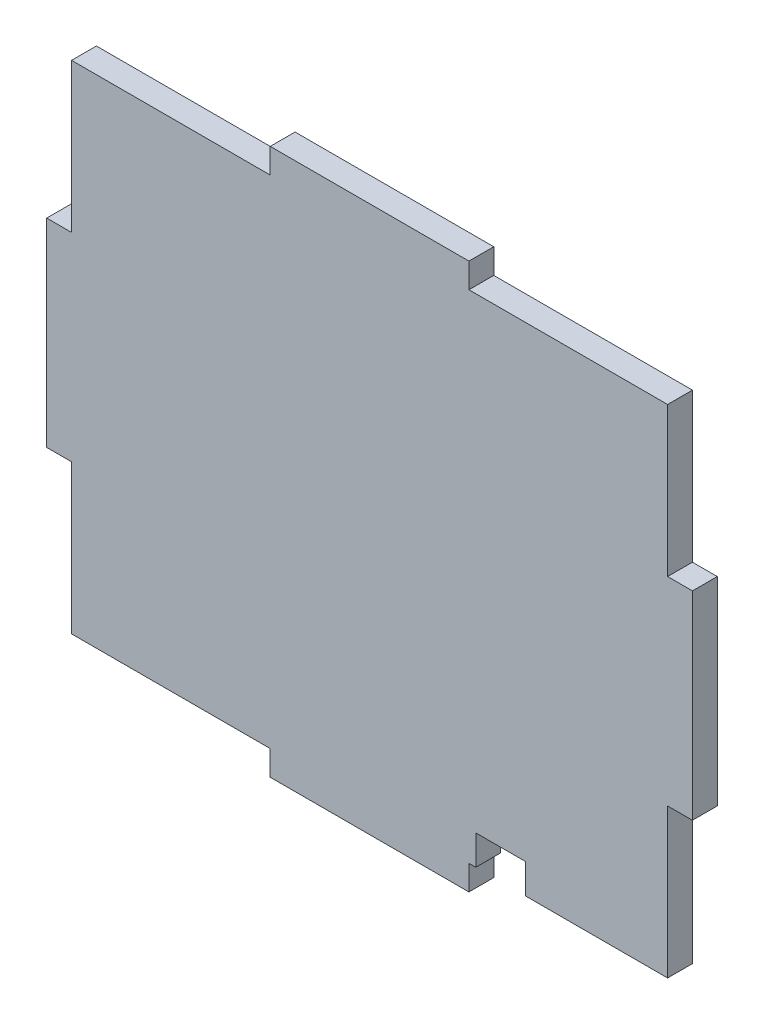
ISO-10303-21;
HEADER;
FILE_DESCRIPTION(('STEP AP214'),'2;1');
FILE_NAME('part.step','',(''),(''),'','','');
FILE_SCHEMA(('AUTOMOTIVE_DESIGN { 1 0 10303 214 1 1 1 1 }'));
ENDSEC;
DATA;
#1=APPLICATION_CONTEXT('core data for automotive mechanical design processes');
#2=APPLICATION_PROTOCOL_DEFINITION('international standard','automotive_design',2000,#1);
#3=PRODUCT_CONTEXT('',#1,'mechanical');
#4=PRODUCT('Part','Part','',(#3));
#5=PRODUCT_RELATED_PRODUCT_CATEGORY('part','',(#4));
#6=PRODUCT_DEFINITION_FORMATION('','',#4);
#7=PRODUCT_DEFINITION_CONTEXT('part definition',#1,'design');
#8=PRODUCT_DEFINITION('design','',#6,#7);
#9=PRODUCT_DEFINITION_SHAPE('','',#8);
#10=(LENGTH_UNIT() NAMED_UNIT(*) SI_UNIT(.MILLI.,.METRE.));
#11=(NAMED_UNIT(*) PLANE_ANGLE_UNIT() SI_UNIT($,.RADIAN.));
#12=(NAMED_UNIT(*) SI_UNIT($,.STERADIAN.) SOLID_ANGLE_UNIT());
#13=UNCERTAINTY_MEASURE_WITH_UNIT(LENGTH_MEASURE(1.E-05),#10,'distance_accuracy_value','');
#14=(GEOMETRIC_REPRESENTATION_CONTEXT(3) GLOBAL_UNCERTAINTY_ASSIGNED_CONTEXT((#13)) GLOBAL_UNIT_ASSIGNED_CONTEXT((#10,
#11,#12)) REPRESENTATION_CONTEXT('',''));
#15=CARTESIAN_POINT('',(0.,0.,0.));
#16=DIRECTION('',(0.,0.,1.));
#17=DIRECTION('',(1.,0.,0.));
#18=AXIS2_PLACEMENT_3D('',#15,#16,#17);
#19=CARTESIAN_POINT('',(0.,-22.,1.25));
#20=DIRECTION('',(0.,1.,0.));
#21=DIRECTION('',(0.,0.,1.));
#22=AXIS2_PLACEMENT_3D('',#19,#20,#21);
#23=PLANE('',#22);
#24=DIRECTION('',(1.,0.,0.));
#25=VECTOR('',#24,1.);
#26=CARTESIAN_POINT('',(0.,-22.,-1.25));
#27=LINE('',#26,#25);
#28=CARTESIAN_POINT('',(10.69,-22.,-1.25));
#29=VERTEX_POINT('',#28);
#30=CARTESIAN_POINT('',(15.69,-22.,-1.25));
#31=VERTEX_POINT('',#30);
#32=EDGE_CURVE('E337',#29,#31,#27,.T.);
#33=ORIENTED_EDGE('',*,*,#32,.T.);
#34=DIRECTION('',(0.,0.,-1.));
#35=VECTOR('',#34,1.);
#36=CARTESIAN_POINT('',(15.69,-22.,1.25));
#37=LINE('',#36,#35);
#38=CARTESIAN_POINT('',(15.69,-22.,1.25));
#39=VERTEX_POINT('',#38);
#40=EDGE_CURVE('E11',#39,#31,#37,.T.);
#41=ORIENTED_EDGE('',*,*,#40,.F.);
#42=DIRECTION('',(1.,0.,0.));
#43=VECTOR('',#42,1.);
#44=CARTESIAN_POINT('',(0.,-22.,1.25));
#45=LINE('',#44,#43);
#46=CARTESIAN_POINT('',(10.69,-22.,1.25));
#47=VERTEX_POINT('',#46);
#48=EDGE_CURVE('E244',#47,#39,#45,.T.);
#49=ORIENTED_EDGE('',*,*,#48,.F.);
#50=DIRECTION('',(0.,0.,-1.));
#51=VECTOR('',#50,1.);
#52=CARTESIAN_POINT('',(10.69,-22.,1.25));
#53=LINE('',#52,#51);
#54=EDGE_CURVE('E231',#47,#29,#53,.T.);
#55=ORIENTED_EDGE('',*,*,#54,.T.);
#56=EDGE_LOOP('',(#33,#41,#49,#55));
#57=FACE_BOUND('',#56,.T.);
#58=ADVANCED_FACE('F39',(#57),#23,.F.);
#59=CARTESIAN_POINT('',(15.69,0.,1.25));
#60=DIRECTION('',(1.,0.,0.));
#61=DIRECTION('',(0.,0.,-1.));
#62=AXIS2_PLACEMENT_3D('',#59,#60,#61);
#63=PLANE('',#62);
#64=DIRECTION('',(0.,-1.,0.));
#65=VECTOR('',#64,1.);
#66=CARTESIAN_POINT('',(15.69,0.,-1.25));
#67=LINE('',#66,#65);
#68=CARTESIAN_POINT('',(15.69,-25.,-1.25));
#69=VERTEX_POINT('',#68);
#70=EDGE_CURVE('E331',#31,#69,#67,.T.);
#71=ORIENTED_EDGE('',*,*,#70,.T.);
#72=DIRECTION('',(0.,0.,-1.));
#73=VECTOR('',#72,1.);
#74=CARTESIAN_POINT('',(15.69,-25.,1.25));
#75=LINE('',#74,#73);
#76=CARTESIAN_POINT('',(15.69,-25.,1.25));
#77=VERTEX_POINT('',#76);
#78=EDGE_CURVE('E48',#77,#69,#75,.T.);
#79=ORIENTED_EDGE('',*,*,#78,.F.);
#80=DIRECTION('',(0.,-1.,0.));
#81=VECTOR('',#80,1.);
#82=CARTESIAN_POINT('',(15.69,0.,1.25));
#83=LINE('',#82,#81);
#84=EDGE_CURVE('E143',#39,#77,#83,.T.);
#85=ORIENTED_EDGE('',*,*,#84,.F.);
#86=ORIENTED_EDGE('',*,*,#40,.T.);
#87=EDGE_LOOP('',(#71,#79,#85,#86));
#88=FACE_BOUND('',#87,.T.);
#89=ADVANCED_FACE('F332',(#88),#63,.F.);
#90=CARTESIAN_POINT('',(0.,-25.,1.25));
#91=DIRECTION('',(0.,-1.,0.));
#92=DIRECTION('',(1.,0.,0.));
#93=AXIS2_PLACEMENT_3D('',#90,#91,#92);
#94=PLANE('',#93);
#95=DIRECTION('',(-1.,0.,0.));
#96=VECTOR('',#95,1.);
#97=CARTESIAN_POINT('',(0.,-25.,-1.25));
#98=LINE('',#97,#96);
#99=CARTESIAN_POINT('',(30.,-25.,-1.25));
#100=VERTEX_POINT('',#99);
#101=EDGE_CURVE('E254',#100,#69,#98,.T.);
#102=ORIENTED_EDGE('',*,*,#101,.F.);
#103=DIRECTION('',(0.,0.,-1.));
#104=VECTOR('',#103,1.);
#105=CARTESIAN_POINT('',(30.,-25.,1.25));
#106=LINE('',#105,#104);
#107=CARTESIAN_POINT('',(30.,-25.,1.25));
#108=VERTEX_POINT('',#107);
#109=EDGE_CURVE('E323',#108,#100,#106,.T.);
#110=ORIENTED_EDGE('',*,*,#109,.F.);
#111=DIRECTION('',(-1.,0.,0.));
#112=VECTOR('',#111,1.);
#113=CARTESIAN_POINT('',(0.,-25.,1.25));
#114=LINE('',#113,#112);
#115=EDGE_CURVE('E229',#108,#77,#114,.T.);
#116=ORIENTED_EDGE('',*,*,#115,.T.);
#117=ORIENTED_EDGE('',*,*,#78,.T.);
#118=EDGE_LOOP('',(#102,#110,#116,#117));
#119=FACE_BOUND('',#118,.T.);
#120=ADVANCED_FACE('F328',(#119),#94,.T.);
#121=CARTESIAN_POINT('',(30.,0.,1.25));
#122=DIRECTION('',(1.,0.,0.));
#123=DIRECTION('',(0.,1.,0.));
#124=AXIS2_PLACEMENT_3D('',#121,#122,#123);
#125=PLANE('',#124);
#126=DIRECTION('',(0.,-1.,0.));
#127=VECTOR('',#126,1.);
#128=CARTESIAN_POINT('',(30.,0.,-1.25));
#129=LINE('',#128,#127);
#130=CARTESIAN_POINT('',(30.,-9.99999999999998,-1.25));
#131=VERTEX_POINT('',#130);
#132=EDGE_CURVE('E342',#131,#100,#129,.T.);
#133=ORIENTED_EDGE('',*,*,#132,.F.);
#134=DIRECTION('',(0.,0.,-1.));
#135=VECTOR('',#134,1.);
#136=CARTESIAN_POINT('',(30.,-9.99999999999998,1.25));
#137=LINE('',#136,#135);
#138=CARTESIAN_POINT('',(30.,-9.99999999999998,1.25));
#139=VERTEX_POINT('',#138);
#140=EDGE_CURVE('E320',#139,#131,#137,.T.);
#141=ORIENTED_EDGE('',*,*,#140,.F.);
#142=DIRECTION('',(0.,-1.,0.));
#143=VECTOR('',#142,1.);
#144=CARTESIAN_POINT('',(30.,0.,1.25));
#145=LINE('',#144,#143);
#146=EDGE_CURVE('E237',#139,#108,#145,.T.);
#147=ORIENTED_EDGE('',*,*,#146,.T.);
#148=ORIENTED_EDGE('',*,*,#109,.T.);
#149=EDGE_LOOP('',(#133,#141,#147,#148));
#150=FACE_BOUND('',#149,.T.);
#151=ADVANCED_FACE('F555',(#150),#125,.T.);
#152=CARTESIAN_POINT('',(0.,-9.99999999999968,1.25));
#153=DIRECTION('',(0.,-1.,0.));
#154=DIRECTION('',(1.,0.,0.));
#155=AXIS2_PLACEMENT_3D('',#152,#153,#154);
#156=PLANE('',#155);
#157=DIRECTION('',(-1.,0.,0.));
#158=VECTOR('',#157,1.);
#159=CARTESIAN_POINT('',(0.,-9.99999999999968,-1.25));
#160=LINE('',#159,#158);
#161=CARTESIAN_POINT('',(32.5,-10.,-1.25));
#162=VERTEX_POINT('',#161);
#163=EDGE_CURVE('E345',#162,#131,#160,.T.);
#164=ORIENTED_EDGE('',*,*,#163,.F.);
#165=DIRECTION('',(0.,0.,-1.));
#166=VECTOR('',#165,1.);
#167=CARTESIAN_POINT('',(32.5,-10.,1.25));
#168=LINE('',#167,#166);
#169=CARTESIAN_POINT('',(32.5,-10.,1.25));
#170=VERTEX_POINT('',#169);
#171=EDGE_CURVE('E317',#170,#162,#168,.T.);
#172=ORIENTED_EDGE('',*,*,#171,.F.);
#173=DIRECTION('',(-1.,0.,0.));
#174=VECTOR('',#173,1.);
#175=CARTESIAN_POINT('',(0.,-9.99999999999968,1.25));
#176=LINE('',#175,#174);
#177=EDGE_CURVE('E243',#170,#139,#176,.T.);
#178=ORIENTED_EDGE('',*,*,#177,.T.);
#179=ORIENTED_EDGE('',*,*,#140,.T.);
#180=EDGE_LOOP('',(#164,#172,#178,#179));
#181=FACE_BOUND('',#180,.T.);
#182=ADVANCED_FACE('F470',(#181),#156,.T.);
#183=CARTESIAN_POINT('',(32.5,0.,1.25));
#184=DIRECTION('',(1.,0.,0.));
#185=DIRECTION('',(0.,0.,-1.));
#186=AXIS2_PLACEMENT_3D('',#183,#184,#185);
#187=PLANE('',#186);
#188=DIRECTION('',(0.,-1.,0.));
#189=VECTOR('',#188,1.);
#190=CARTESIAN_POINT('',(32.5,0.,-1.25));
#191=LINE('',#190,#189);
#192=CARTESIAN_POINT('',(32.5,10.,-1.25));
#193=VERTEX_POINT('',#192);
#194=EDGE_CURVE('E351',#193,#162,#191,.T.);
#195=ORIENTED_EDGE('',*,*,#194,.F.);
#196=DIRECTION('',(0.,0.,-1.));
#197=VECTOR('',#196,1.);
#198=CARTESIAN_POINT('',(32.5,10.,1.25));
#199=LINE('',#198,#197);
#200=CARTESIAN_POINT('',(32.5,10.,1.25));
#201=VERTEX_POINT('',#200);
#202=EDGE_CURVE('E314',#201,#193,#199,.T.);
#203=ORIENTED_EDGE('',*,*,#202,.F.);
#204=DIRECTION('',(0.,-1.,0.));
#205=VECTOR('',#204,1.);
#206=CARTESIAN_POINT('',(32.5,0.,1.25));
#207=LINE('',#206,#205);
#208=EDGE_CURVE('E461',#201,#170,#207,.T.);
#209=ORIENTED_EDGE('',*,*,#208,.T.);
#210=ORIENTED_EDGE('',*,*,#171,.T.);
#211=EDGE_LOOP('',(#195,#203,#209,#210));
#212=FACE_BOUND('',#211,.T.);
#213=ADVANCED_FACE('F475',(#212),#187,.T.);
#214=CARTESIAN_POINT('',(0.,9.99999999999968,1.25));
#215=DIRECTION('',(0.,-1.,0.));
#216=DIRECTION('',(1.,0.,0.));
#217=AXIS2_PLACEMENT_3D('',#214,#215,#216);
#218=PLANE('',#217);
#219=DIRECTION('',(-1.,0.,0.));
#220=VECTOR('',#219,1.);
#221=CARTESIAN_POINT('',(0.,9.99999999999968,-1.25));
#222=LINE('',#221,#220);
#223=CARTESIAN_POINT('',(30.,9.99999999999998,-1.25));
#224=VERTEX_POINT('',#223);
#225=EDGE_CURVE('E355',#193,#224,#222,.T.);
#226=ORIENTED_EDGE('',*,*,#225,.T.);
#227=DIRECTION('',(0.,0.,-1.));
#228=VECTOR('',#227,1.);
#229=CARTESIAN_POINT('',(30.,9.99999999999998,1.25));
#230=LINE('',#229,#228);
#231=CARTESIAN_POINT('',(30.,9.99999999999998,1.25));
#232=VERTEX_POINT('',#231);
#233=EDGE_CURVE('E310',#232,#224,#230,.T.);
#234=ORIENTED_EDGE('',*,*,#233,.F.);
#235=DIRECTION('',(-1.,0.,0.));
#236=VECTOR('',#235,1.);
#237=CARTESIAN_POINT('',(0.,9.99999999999968,1.25));
#238=LINE('',#237,#236);
#239=EDGE_CURVE('E458',#201,#232,#238,.T.);
#240=ORIENTED_EDGE('',*,*,#239,.F.);
#241=ORIENTED_EDGE('',*,*,#202,.T.);
#242=EDGE_LOOP('',(#226,#234,#240,#241));
#243=FACE_BOUND('',#242,.T.);
#244=ADVANCED_FACE('F480',(#243),#218,.F.);
#245=CARTESIAN_POINT('',(30.,0.,1.25));
#246=DIRECTION('',(-1.,0.,0.));
#247=DIRECTION('',(0.,-1.,0.));
#248=AXIS2_PLACEMENT_3D('',#245,#246,#247);
#249=PLANE('',#248);
#250=DIRECTION('',(0.,1.,0.));
#251=VECTOR('',#250,1.);
#252=CARTESIAN_POINT('',(30.,0.,-1.25));
#253=LINE('',#252,#251);
#254=CARTESIAN_POINT('',(30.,25.,-1.25));
#255=VERTEX_POINT('',#254);
#256=EDGE_CURVE('E358',#224,#255,#253,.T.);
#257=ORIENTED_EDGE('',*,*,#256,.T.);
#258=DIRECTION('',(0.,0.,-1.));
#259=VECTOR('',#258,1.);
#260=CARTESIAN_POINT('',(30.,25.,1.25));
#261=LINE('',#260,#259);
#262=CARTESIAN_POINT('',(30.,25.,1.25));
#263=VERTEX_POINT('',#262);
#264=EDGE_CURVE('E306',#263,#255,#261,.T.);
#265=ORIENTED_EDGE('',*,*,#264,.F.);
#266=DIRECTION('',(0.,1.,0.));
#267=VECTOR('',#266,1.);
#268=CARTESIAN_POINT('',(30.,0.,1.25));
#269=LINE('',#268,#267);
#270=EDGE_CURVE('E455',#232,#263,#269,.T.);
#271=ORIENTED_EDGE('',*,*,#270,.F.);
#272=ORIENTED_EDGE('',*,*,#233,.T.);
#273=EDGE_LOOP('',(#257,#265,#271,#272));
#274=FACE_BOUND('',#273,.T.);
#275=ADVANCED_FACE('F486',(#274),#249,.F.);
#276=CARTESIAN_POINT('',(0.,25.,1.25));
#277=DIRECTION('',(0.,-1.,0.));
#278=DIRECTION('',(1.,0.,0.));
#279=AXIS2_PLACEMENT_3D('',#276,#277,#278);
#280=PLANE('',#279);
#281=DIRECTION('',(-1.,0.,0.));
#282=VECTOR('',#281,1.);
#283=CARTESIAN_POINT('',(0.,25.,-1.25));
#284=LINE('',#283,#282);
#285=CARTESIAN_POINT('',(10.,25.,-1.25));
#286=VERTEX_POINT('',#285);
#287=EDGE_CURVE('E361',#255,#286,#284,.T.);
#288=ORIENTED_EDGE('',*,*,#287,.T.);
#289=DIRECTION('',(0.,0.,-1.));
#290=VECTOR('',#289,1.);
#291=CARTESIAN_POINT('',(10.,25.,1.25));
#292=LINE('',#291,#290);
#293=CARTESIAN_POINT('',(10.,25.,1.25));
#294=VERTEX_POINT('',#293);
#295=EDGE_CURVE('E302',#294,#286,#292,.T.);
#296=ORIENTED_EDGE('',*,*,#295,.F.);
#297=DIRECTION('',(-1.,0.,0.));
#298=VECTOR('',#297,1.);
#299=CARTESIAN_POINT('',(0.,25.,1.25));
#300=LINE('',#299,#298);
#301=EDGE_CURVE('E452',#263,#294,#300,.T.);
#302=ORIENTED_EDGE('',*,*,#301,.F.);
#303=ORIENTED_EDGE('',*,*,#264,.T.);
#304=EDGE_LOOP('',(#288,#296,#302,#303));
#305=FACE_BOUND('',#304,.T.);
#306=ADVANCED_FACE('F490',(#305),#280,.F.);
#307=CARTESIAN_POINT('',(10.,0.,1.25));
#308=DIRECTION('',(-1.,0.,0.));
#309=DIRECTION('',(0.,-1.,0.));
#310=AXIS2_PLACEMENT_3D('',#307,#308,#309);
#311=PLANE('',#310);
#312=DIRECTION('',(0.,1.,0.));
#313=VECTOR('',#312,1.);
#314=CARTESIAN_POINT('',(10.,0.,-1.25));
#315=LINE('',#314,#313);
#316=CARTESIAN_POINT('',(10.,27.5,-1.25));
#317=VERTEX_POINT('',#316);
#318=EDGE_CURVE('E364',#286,#317,#315,.T.);
#319=ORIENTED_EDGE('',*,*,#318,.T.);
#320=DIRECTION('',(0.,0.,-1.));
#321=VECTOR('',#320,1.);
#322=CARTESIAN_POINT('',(10.,27.5,1.25));
#323=LINE('',#322,#321);
#324=CARTESIAN_POINT('',(10.,27.5,1.25));
#325=VERTEX_POINT('',#324);
#326=EDGE_CURVE('E299',#325,#317,#323,.T.);
#327=ORIENTED_EDGE('',*,*,#326,.F.);
#328=DIRECTION('',(0.,1.,0.));
#329=VECTOR('',#328,1.);
#330=CARTESIAN_POINT('',(10.,0.,1.25));
#331=LINE('',#330,#329);
#332=EDGE_CURVE('E449',#294,#325,#331,.T.);
#333=ORIENTED_EDGE('',*,*,#332,.F.);
#334=ORIENTED_EDGE('',*,*,#295,.T.);
#335=EDGE_LOOP('',(#319,#327,#333,#334));
#336=FACE_BOUND('',#335,.T.);
#337=ADVANCED_FACE('F495',(#336),#311,.F.);
#338=CARTESIAN_POINT('',(0.,27.5,1.25));
#339=DIRECTION('',(0.,1.,0.));
#340=DIRECTION('',(0.,0.,1.));
#341=AXIS2_PLACEMENT_3D('',#338,#339,#340);
#342=PLANE('',#341);
#343=DIRECTION('',(1.,0.,0.));
#344=VECTOR('',#343,1.);
#345=CARTESIAN_POINT('',(0.,27.5,-1.25));
#346=LINE('',#345,#344);
#347=CARTESIAN_POINT('',(-10.,27.5,-1.25));
#348=VERTEX_POINT('',#347);
#349=EDGE_CURVE('E368',#348,#317,#346,.T.);
#350=ORIENTED_EDGE('',*,*,#349,.F.);
#351=DIRECTION('',(0.,0.,-1.));
#352=VECTOR('',#351,1.);
#353=CARTESIAN_POINT('',(-10.,27.5,1.25));
#354=LINE('',#353,#352);
#355=CARTESIAN_POINT('',(-10.,27.5,1.25));
#356=VERTEX_POINT('',#355);
#357=EDGE_CURVE('E296',#356,#348,#354,.T.);
#358=ORIENTED_EDGE('',*,*,#357,.F.);
#359=DIRECTION('',(1.,0.,0.));
#360=VECTOR('',#359,1.);
#361=CARTESIAN_POINT('',(0.,27.5,1.25));
#362=LINE('',#361,#360);
#363=EDGE_CURVE('E445',#356,#325,#362,.T.);
#364=ORIENTED_EDGE('',*,*,#363,.T.);
#365=ORIENTED_EDGE('',*,*,#326,.T.);
#366=EDGE_LOOP('',(#350,#358,#364,#365));
#367=FACE_BOUND('',#366,.T.);
#368=ADVANCED_FACE('F573',(#367),#342,.T.);
#369=CARTESIAN_POINT('',(-10.,0.,1.25));
#370=DIRECTION('',(-1.,0.,0.));
#371=DIRECTION('',(0.,-1.,0.));
#372=AXIS2_PLACEMENT_3D('',#369,#370,#371);
#373=PLANE('',#372);
#374=DIRECTION('',(0.,1.,0.));
#375=VECTOR('',#374,1.);
#376=CARTESIAN_POINT('',(-10.,0.,-1.25));
#377=LINE('',#376,#375);
#378=CARTESIAN_POINT('',(-10.,25.,-1.25));
#379=VERTEX_POINT('',#378);
#380=EDGE_CURVE('E372',#379,#348,#377,.T.);
#381=ORIENTED_EDGE('',*,*,#380,.F.);
#382=DIRECTION('',(0.,0.,-1.));
#383=VECTOR('',#382,1.);
#384=CARTESIAN_POINT('',(-10.,25.,1.25));
#385=LINE('',#384,#383);
#386=CARTESIAN_POINT('',(-10.,25.,1.25));
#387=VERTEX_POINT('',#386);
#388=EDGE_CURVE('E293',#387,#379,#385,.T.);
#389=ORIENTED_EDGE('',*,*,#388,.F.);
#390=DIRECTION('',(0.,1.,0.));
#391=VECTOR('',#390,1.);
#392=CARTESIAN_POINT('',(-10.,0.,1.25));
#393=LINE('',#392,#391);
#394=EDGE_CURVE('E441',#387,#356,#393,.T.);
#395=ORIENTED_EDGE('',*,*,#394,.T.);
#396=ORIENTED_EDGE('',*,*,#357,.T.);
#397=EDGE_LOOP('',(#381,#389,#395,#396));
#398=FACE_BOUND('',#397,.T.);
#399=ADVANCED_FACE('F502',(#398),#373,.T.);
#400=CARTESIAN_POINT('',(0.,25.,1.25));
#401=DIRECTION('',(0.,1.,0.));
#402=DIRECTION('',(0.,0.,1.));
#403=AXIS2_PLACEMENT_3D('',#400,#401,#402);
#404=PLANE('',#403);
#405=DIRECTION('',(1.,0.,0.));
#406=VECTOR('',#405,1.);
#407=CARTESIAN_POINT('',(0.,25.,-1.25));
#408=LINE('',#407,#406);
#409=CARTESIAN_POINT('',(-30.,25.,-1.25));
#410=VERTEX_POINT('',#409);
#411=EDGE_CURVE('E376',#410,#379,#408,.T.);
#412=ORIENTED_EDGE('',*,*,#411,.F.);
#413=DIRECTION('',(0.,0.,-1.));
#414=VECTOR('',#413,1.);
#415=CARTESIAN_POINT('',(-30.,25.,1.25));
#416=LINE('',#415,#414);
#417=CARTESIAN_POINT('',(-30.,25.,1.25));
#418=VERTEX_POINT('',#417);
#419=EDGE_CURVE('E290',#418,#410,#416,.T.);
#420=ORIENTED_EDGE('',*,*,#419,.F.);
#421=DIRECTION('',(1.,0.,0.));
#422=VECTOR('',#421,1.);
#423=CARTESIAN_POINT('',(0.,25.,1.25));
#424=LINE('',#423,#422);
#425=EDGE_CURVE('E437',#418,#387,#424,.T.);
#426=ORIENTED_EDGE('',*,*,#425,.T.);
#427=ORIENTED_EDGE('',*,*,#388,.T.);
#428=EDGE_LOOP('',(#412,#420,#426,#427));
#429=FACE_BOUND('',#428,.T.);
#430=ADVANCED_FACE('F506',(#429),#404,.T.);
#431=CARTESIAN_POINT('',(-30.,0.,1.25));
#432=DIRECTION('',(-1.,0.,0.));
#433=DIRECTION('',(0.,-1.,0.));
#434=AXIS2_PLACEMENT_3D('',#431,#432,#433);
#435=PLANE('',#434);
#436=DIRECTION('',(0.,1.,0.));
#437=VECTOR('',#436,1.);
#438=CARTESIAN_POINT('',(-30.,0.,-1.25));
#439=LINE('',#438,#437);
#440=CARTESIAN_POINT('',(-30.,9.99999999999998,-1.25));
#441=VERTEX_POINT('',#440);
#442=EDGE_CURVE('E380',#441,#410,#439,.T.);
#443=ORIENTED_EDGE('',*,*,#442,.F.);
#444=DIRECTION('',(0.,0.,-1.));
#445=VECTOR('',#444,1.);
#446=CARTESIAN_POINT('',(-30.,9.99999999999998,1.25));
#447=LINE('',#446,#445);
#448=CARTESIAN_POINT('',(-30.,9.99999999999998,1.25));
#449=VERTEX_POINT('',#448);
#450=EDGE_CURVE('E287',#449,#441,#447,.T.);
#451=ORIENTED_EDGE('',*,*,#450,.F.);
#452=DIRECTION('',(0.,1.,0.));
#453=VECTOR('',#452,1.);
#454=CARTESIAN_POINT('',(-30.,0.,1.25));
#455=LINE('',#454,#453);
#456=EDGE_CURVE('E433',#449,#418,#455,.T.);
#457=ORIENTED_EDGE('',*,*,#456,.T.);
#458=ORIENTED_EDGE('',*,*,#419,.T.);
#459=EDGE_LOOP('',(#443,#451,#457,#458));
#460=FACE_BOUND('',#459,.T.);
#461=ADVANCED_FACE('F511',(#460),#435,.T.);
#462=CARTESIAN_POINT('',(0.,9.99999999999968,1.25));
#463=DIRECTION('',(0.,1.,0.));
#464=DIRECTION('',(-1.,0.,0.));
#465=AXIS2_PLACEMENT_3D('',#462,#463,#464);
#466=PLANE('',#465);
#467=DIRECTION('',(1.,0.,0.));
#468=VECTOR('',#467,1.);
#469=CARTESIAN_POINT('',(0.,9.99999999999968,-1.25));
#470=LINE('',#469,#468);
#471=CARTESIAN_POINT('',(-32.5,10.,-1.25));
#472=VERTEX_POINT('',#471);
#473=EDGE_CURVE('E384',#472,#441,#470,.T.);
#474=ORIENTED_EDGE('',*,*,#473,.F.);
#475=DIRECTION('',(0.,0.,-1.));
#476=VECTOR('',#475,1.);
#477=CARTESIAN_POINT('',(-32.5,10.,1.25));
#478=LINE('',#477,#476);
#479=CARTESIAN_POINT('',(-32.5,10.,1.25));
#480=VERTEX_POINT('',#479);
#481=EDGE_CURVE('E284',#480,#472,#478,.T.);
#482=ORIENTED_EDGE('',*,*,#481,.F.);
#483=DIRECTION('',(1.,0.,0.));
#484=VECTOR('',#483,1.);
#485=CARTESIAN_POINT('',(0.,9.99999999999968,1.25));
#486=LINE('',#485,#484);
#487=EDGE_CURVE('E429',#480,#449,#486,.T.);
#488=ORIENTED_EDGE('',*,*,#487,.T.);
#489=ORIENTED_EDGE('',*,*,#450,.T.);
#490=EDGE_LOOP('',(#474,#482,#488,#489));
#491=FACE_BOUND('',#490,.T.);
#492=ADVANCED_FACE('F514',(#491),#466,.T.);
#493=CARTESIAN_POINT('',(-32.5,0.,1.25));
#494=DIRECTION('',(1.,0.,0.));
#495=DIRECTION('',(0.,0.,-1.));
#496=AXIS2_PLACEMENT_3D('',#493,#494,#495);
#497=PLANE('',#496);
#498=DIRECTION('',(0.,-1.,0.));
#499=VECTOR('',#498,1.);
#500=CARTESIAN_POINT('',(-32.5,0.,-1.25));
#501=LINE('',#500,#499);
#502=CARTESIAN_POINT('',(-32.5,-10.,-1.25));
#503=VERTEX_POINT('',#502);
#504=EDGE_CURVE('E388',#472,#503,#501,.T.);
#505=ORIENTED_EDGE('',*,*,#504,.T.);
#506=DIRECTION('',(0.,0.,-1.));
#507=VECTOR('',#506,1.);
#508=CARTESIAN_POINT('',(-32.5,-10.,1.25));
#509=LINE('',#508,#507);
#510=CARTESIAN_POINT('',(-32.5,-10.,1.25));
#511=VERTEX_POINT('',#510);
#512=EDGE_CURVE('E280',#511,#503,#509,.T.);
#513=ORIENTED_EDGE('',*,*,#512,.F.);
#514=DIRECTION('',(0.,-1.,0.));
#515=VECTOR('',#514,1.);
#516=CARTESIAN_POINT('',(-32.5,0.,1.25));
#517=LINE('',#516,#515);
#518=EDGE_CURVE('E426',#480,#511,#517,.T.);
#519=ORIENTED_EDGE('',*,*,#518,.F.);
#520=ORIENTED_EDGE('',*,*,#481,.T.);
#521=EDGE_LOOP('',(#505,#513,#519,#520));
#522=FACE_BOUND('',#521,.T.);
#523=ADVANCED_FACE('F520',(#522),#497,.F.);
#524=CARTESIAN_POINT('',(0.,-9.99999999999968,1.25));
#525=DIRECTION('',(0.,1.,0.));
#526=DIRECTION('',(-1.,0.,0.));
#527=AXIS2_PLACEMENT_3D('',#524,#525,#526);
#528=PLANE('',#527);
#529=DIRECTION('',(1.,0.,0.));
#530=VECTOR('',#529,1.);
#531=CARTESIAN_POINT('',(0.,-9.99999999999968,-1.25));
#532=LINE('',#531,#530);
#533=CARTESIAN_POINT('',(-30.,-9.99999999999998,-1.25));
#534=VERTEX_POINT('',#533);
#535=EDGE_CURVE('E391',#503,#534,#532,.T.);
#536=ORIENTED_EDGE('',*,*,#535,.T.);
#537=DIRECTION('',(0.,0.,-1.));
#538=VECTOR('',#537,1.);
#539=CARTESIAN_POINT('',(-30.,-9.99999999999998,1.25));
#540=LINE('',#539,#538);
#541=CARTESIAN_POINT('',(-30.,-9.99999999999998,1.25));
#542=VERTEX_POINT('',#541);
#543=EDGE_CURVE('E276',#542,#534,#540,.T.);
#544=ORIENTED_EDGE('',*,*,#543,.F.);
#545=DIRECTION('',(1.,0.,0.));
#546=VECTOR('',#545,1.);
#547=CARTESIAN_POINT('',(0.,-9.99999999999968,1.25));
#548=LINE('',#547,#546);
#549=EDGE_CURVE('E423',#511,#542,#548,.T.);
#550=ORIENTED_EDGE('',*,*,#549,.F.);
#551=ORIENTED_EDGE('',*,*,#512,.T.);
#552=EDGE_LOOP('',(#536,#544,#550,#551));
#553=FACE_BOUND('',#552,.T.);
#554=ADVANCED_FACE('F524',(#553),#528,.F.);
#555=CARTESIAN_POINT('',(-30.,0.,1.25));
#556=DIRECTION('',(1.,0.,0.));
#557=DIRECTION('',(0.,1.,0.));
#558=AXIS2_PLACEMENT_3D('',#555,#556,#557);
#559=PLANE('',#558);
#560=DIRECTION('',(0.,-1.,0.));
#561=VECTOR('',#560,1.);
#562=CARTESIAN_POINT('',(-30.,0.,-1.25));
#563=LINE('',#562,#561);
#564=CARTESIAN_POINT('',(-30.,-25.,-1.25));
#565=VERTEX_POINT('',#564);
#566=EDGE_CURVE('E394',#534,#565,#563,.T.);
#567=ORIENTED_EDGE('',*,*,#566,.T.);
#568=DIRECTION('',(0.,0.,-1.));
#569=VECTOR('',#568,1.);
#570=CARTESIAN_POINT('',(-30.,-25.,1.25));
#571=LINE('',#570,#569);
#572=CARTESIAN_POINT('',(-30.,-25.,1.25));
#573=VERTEX_POINT('',#572);
#574=EDGE_CURVE('E272',#573,#565,#571,.T.);
#575=ORIENTED_EDGE('',*,*,#574,.F.);
#576=DIRECTION('',(0.,-1.,0.));
#577=VECTOR('',#576,1.);
#578=CARTESIAN_POINT('',(-30.,0.,1.25));
#579=LINE('',#578,#577);
#580=EDGE_CURVE('E420',#542,#573,#579,.T.);
#581=ORIENTED_EDGE('',*,*,#580,.F.);
#582=ORIENTED_EDGE('',*,*,#543,.T.);
#583=EDGE_LOOP('',(#567,#575,#581,#582));
#584=FACE_BOUND('',#583,.T.);
#585=ADVANCED_FACE('F529',(#584),#559,.F.);
#586=CARTESIAN_POINT('',(0.,-25.,1.25));
#587=DIRECTION('',(0.,1.,0.));
#588=DIRECTION('',(-1.,0.,0.));
#589=AXIS2_PLACEMENT_3D('',#586,#587,#588);
#590=PLANE('',#589);
#591=DIRECTION('',(1.,0.,0.));
#592=VECTOR('',#591,1.);
#593=CARTESIAN_POINT('',(0.,-25.,-1.25));
#594=LINE('',#593,#592);
#595=CARTESIAN_POINT('',(-10.,-25.,-1.25));
#596=VERTEX_POINT('',#595);
#597=EDGE_CURVE('E397',#565,#596,#594,.T.);
#598=ORIENTED_EDGE('',*,*,#597,.T.);
#599=DIRECTION('',(0.,0.,-1.));
#600=VECTOR('',#599,1.);
#601=CARTESIAN_POINT('',(-10.,-25.,1.25));
#602=LINE('',#601,#600);
#603=CARTESIAN_POINT('',(-10.,-25.,1.25));
#604=VERTEX_POINT('',#603);
#605=EDGE_CURVE('E268',#604,#596,#602,.T.);
#606=ORIENTED_EDGE('',*,*,#605,.F.);
#607=DIRECTION('',(1.,0.,0.));
#608=VECTOR('',#607,1.);
#609=CARTESIAN_POINT('',(0.,-25.,1.25));
#610=LINE('',#609,#608);
#611=EDGE_CURVE('E417',#573,#604,#610,.T.);
#612=ORIENTED_EDGE('',*,*,#611,.F.);
#613=ORIENTED_EDGE('',*,*,#574,.T.);
#614=EDGE_LOOP('',(#598,#606,#612,#613));
#615=FACE_BOUND('',#614,.T.);
#616=ADVANCED_FACE('F535',(#615),#590,.F.);
#617=CARTESIAN_POINT('',(-10.,0.,1.25));
#618=DIRECTION('',(1.,0.,0.));
#619=DIRECTION('',(0.,1.,0.));
#620=AXIS2_PLACEMENT_3D('',#617,#618,#619);
#621=PLANE('',#620);
#622=DIRECTION('',(0.,-1.,0.));
#623=VECTOR('',#622,1.);
#624=CARTESIAN_POINT('',(-10.,0.,-1.25));
#625=LINE('',#624,#623);
#626=CARTESIAN_POINT('',(-10.,-27.5,-1.25));
#627=VERTEX_POINT('',#626);
#628=EDGE_CURVE('E400',#596,#627,#625,.T.);
#629=ORIENTED_EDGE('',*,*,#628,.T.);
#630=DIRECTION('',(0.,0.,-1.));
#631=VECTOR('',#630,1.);
#632=CARTESIAN_POINT('',(-10.,-27.5,1.25));
#633=LINE('',#632,#631);
#634=CARTESIAN_POINT('',(-10.,-27.5,1.25));
#635=VERTEX_POINT('',#634);
#636=EDGE_CURVE('E264',#635,#627,#633,.T.);
#637=ORIENTED_EDGE('',*,*,#636,.F.);
#638=DIRECTION('',(0.,-1.,0.));
#639=VECTOR('',#638,1.);
#640=CARTESIAN_POINT('',(-10.,0.,1.25));
#641=LINE('',#640,#639);
#642=EDGE_CURVE('E414',#604,#635,#641,.T.);
#643=ORIENTED_EDGE('',*,*,#642,.F.);
#644=ORIENTED_EDGE('',*,*,#605,.T.);
#645=EDGE_LOOP('',(#629,#637,#643,#644));
#646=FACE_BOUND('',#645,.T.);
#647=ADVANCED_FACE('F538',(#646),#621,.F.);
#648=CARTESIAN_POINT('',(0.,-27.5,1.25));
#649=DIRECTION('',(0.,1.,0.));
#650=DIRECTION('',(0.,0.,1.));
#651=AXIS2_PLACEMENT_3D('',#648,#649,#650);
#652=PLANE('',#651);
#653=DIRECTION('',(1.,0.,0.));
#654=VECTOR('',#653,1.);
#655=CARTESIAN_POINT('',(0.,-27.5,-1.25));
#656=LINE('',#655,#654);
#657=CARTESIAN_POINT('',(10.,-27.5,-1.25));
#658=VERTEX_POINT('',#657);
#659=EDGE_CURVE('E402',#627,#658,#656,.T.);
#660=ORIENTED_EDGE('',*,*,#659,.T.);
#661=DIRECTION('',(0.,0.,-1.));
#662=VECTOR('',#661,1.);
#663=CARTESIAN_POINT('',(10.,-27.5,1.25));
#664=LINE('',#663,#662);
#665=CARTESIAN_POINT('',(10.,-27.5,1.25));
#666=VERTEX_POINT('',#665);
#667=EDGE_CURVE('E217',#666,#658,#664,.T.);
#668=ORIENTED_EDGE('',*,*,#667,.F.);
#669=DIRECTION('',(1.,0.,0.));
#670=VECTOR('',#669,1.);
#671=CARTESIAN_POINT('',(0.,-27.5,1.25));
#672=LINE('',#671,#670);
#673=EDGE_CURVE('E222',#635,#666,#672,.T.);
#674=ORIENTED_EDGE('',*,*,#673,.F.);
#675=ORIENTED_EDGE('',*,*,#636,.T.);
#676=EDGE_LOOP('',(#660,#668,#674,#675));
#677=FACE_BOUND('',#676,.T.);
#678=ADVANCED_FACE('F539',(#677),#652,.F.);
#679=CARTESIAN_POINT('',(10.,0.,1.25));
#680=DIRECTION('',(1.,0.,0.));
#681=DIRECTION('',(0.,1.,0.));
#682=AXIS2_PLACEMENT_3D('',#679,#680,#681);
#683=PLANE('',#682);
#684=DIRECTION('',(0.,-1.,0.));
#685=VECTOR('',#684,1.);
#686=CARTESIAN_POINT('',(10.,0.,-1.25));
#687=LINE('',#686,#685);
#688=CARTESIAN_POINT('',(10.,-25.,-1.25));
#689=VERTEX_POINT('',#688);
#690=EDGE_CURVE('E211',#689,#658,#687,.T.);
#691=ORIENTED_EDGE('',*,*,#690,.F.);
#692=DIRECTION('',(0.,0.,-1.));
#693=VECTOR('',#692,1.);
#694=CARTESIAN_POINT('',(10.,-25.,1.25));
#695=LINE('',#694,#693);
#696=CARTESIAN_POINT('',(10.,-25.,1.25));
#697=VERTEX_POINT('',#696);
#698=EDGE_CURVE('E206',#697,#689,#695,.T.);
#699=ORIENTED_EDGE('',*,*,#698,.F.);
#700=DIRECTION('',(0.,-1.,0.));
#701=VECTOR('',#700,1.);
#702=CARTESIAN_POINT('',(10.,0.,1.25));
#703=LINE('',#702,#701);
#704=EDGE_CURVE('E209',#697,#666,#703,.T.);
#705=ORIENTED_EDGE('',*,*,#704,.T.);
#706=ORIENTED_EDGE('',*,*,#667,.T.);
#707=EDGE_LOOP('',(#691,#699,#705,#706));
#708=FACE_BOUND('',#707,.T.);
#709=ADVANCED_FACE('F208',(#708),#683,.T.);
#710=CARTESIAN_POINT('',(10.69,-25.,-1.25));
#711=VERTEX_POINT('',#710);
#712=EDGE_CURVE('E250',#711,#689,#98,.T.);
#713=ORIENTED_EDGE('',*,*,#712,.F.);
#714=DIRECTION('',(0.,0.,-1.));
#715=VECTOR('',#714,1.);
#716=CARTESIAN_POINT('',(10.69,-25.,1.25));
#717=LINE('',#716,#715);
#718=CARTESIAN_POINT('',(10.69,-25.,1.25));
#719=VERTEX_POINT('',#718);
#720=EDGE_CURVE('E132',#719,#711,#717,.T.);
#721=ORIENTED_EDGE('',*,*,#720,.F.);
#722=EDGE_CURVE('E220',#719,#697,#114,.T.);
#723=ORIENTED_EDGE('',*,*,#722,.T.);
#724=ORIENTED_EDGE('',*,*,#698,.T.);
#725=EDGE_LOOP('',(#713,#721,#723,#724));
#726=FACE_BOUND('',#725,.T.);
#727=ADVANCED_FACE('F226',(#726),#94,.T.);
#728=CARTESIAN_POINT('',(10.69,0.,1.25));
#729=DIRECTION('',(-1.,0.,0.));
#730=DIRECTION('',(0.,0.,1.));
#731=AXIS2_PLACEMENT_3D('',#728,#729,#730);
#732=PLANE('',#731);
#733=DIRECTION('',(0.,1.,0.));
#734=VECTOR('',#733,1.);
#735=CARTESIAN_POINT('',(10.69,0.,-1.25));
#736=LINE('',#735,#734);
#737=EDGE_CURVE('E135',#711,#29,#736,.T.);
#738=ORIENTED_EDGE('',*,*,#737,.T.);
#739=ORIENTED_EDGE('',*,*,#54,.F.);
#740=DIRECTION('',(0.,1.,0.));
#741=VECTOR('',#740,1.);
#742=CARTESIAN_POINT('',(10.69,0.,1.25));
#743=LINE('',#742,#741);
#744=EDGE_CURVE('E56',#719,#47,#743,.T.);
#745=ORIENTED_EDGE('',*,*,#744,.F.);
#746=ORIENTED_EDGE('',*,*,#720,.T.);
#747=EDGE_LOOP('',(#738,#739,#745,#746));
#748=FACE_BOUND('',#747,.T.);
#749=ADVANCED_FACE('F618',(#748),#732,.F.);
#750=CARTESIAN_POINT('',(0.,0.,1.25));
#751=DIRECTION('',(0.,0.,1.));
#752=DIRECTION('',(1.,0.,0.));
#753=AXIS2_PLACEMENT_3D('',#750,#751,#752);
#754=PLANE('',#753);
#755=ORIENTED_EDGE('',*,*,#48,.T.);
#756=ORIENTED_EDGE('',*,*,#84,.T.);
#757=ORIENTED_EDGE('',*,*,#115,.F.);
#758=ORIENTED_EDGE('',*,*,#146,.F.);
#759=ORIENTED_EDGE('',*,*,#177,.F.);
#760=ORIENTED_EDGE('',*,*,#208,.F.);
#761=ORIENTED_EDGE('',*,*,#239,.T.);
#762=ORIENTED_EDGE('',*,*,#270,.T.);
#763=ORIENTED_EDGE('',*,*,#301,.T.);
#764=ORIENTED_EDGE('',*,*,#332,.T.);
#765=ORIENTED_EDGE('',*,*,#363,.F.);
#766=ORIENTED_EDGE('',*,*,#394,.F.);
#767=ORIENTED_EDGE('',*,*,#425,.F.);
#768=ORIENTED_EDGE('',*,*,#456,.F.);
#769=ORIENTED_EDGE('',*,*,#487,.F.);
#770=ORIENTED_EDGE('',*,*,#518,.T.);
#771=ORIENTED_EDGE('',*,*,#549,.T.);
#772=ORIENTED_EDGE('',*,*,#580,.T.);
#773=ORIENTED_EDGE('',*,*,#611,.T.);
#774=ORIENTED_EDGE('',*,*,#642,.T.);
#775=ORIENTED_EDGE('',*,*,#673,.T.);
#776=ORIENTED_EDGE('',*,*,#704,.F.);
#777=ORIENTED_EDGE('',*,*,#722,.F.);
#778=ORIENTED_EDGE('',*,*,#744,.T.);
#779=EDGE_LOOP('',(#755,#756,#757,#758,#759,#760,#761,#762,#763,#764,#765,#766,#767,#768,#769,
#770,#771,#772,#773,#774,#775,#776,#777,#778));
#780=FACE_BOUND('',#779,.T.);
#781=ADVANCED_FACE('F219',(#780),#754,.T.);
#782=CARTESIAN_POINT('',(0.,0.,-1.25));
#783=DIRECTION('',(0.,0.,1.));
#784=DIRECTION('',(1.,0.,0.));
#785=AXIS2_PLACEMENT_3D('',#782,#783,#784);
#786=PLANE('',#785);
#787=ORIENTED_EDGE('',*,*,#32,.F.);
#788=ORIENTED_EDGE('',*,*,#737,.F.);
#789=ORIENTED_EDGE('',*,*,#712,.T.);
#790=ORIENTED_EDGE('',*,*,#690,.T.);
#791=ORIENTED_EDGE('',*,*,#659,.F.);
#792=ORIENTED_EDGE('',*,*,#628,.F.);
#793=ORIENTED_EDGE('',*,*,#597,.F.);
#794=ORIENTED_EDGE('',*,*,#566,.F.);
#795=ORIENTED_EDGE('',*,*,#535,.F.);
#796=ORIENTED_EDGE('',*,*,#504,.F.);
#797=ORIENTED_EDGE('',*,*,#473,.T.);
#798=ORIENTED_EDGE('',*,*,#442,.T.);
#799=ORIENTED_EDGE('',*,*,#411,.T.);
#800=ORIENTED_EDGE('',*,*,#380,.T.);
#801=ORIENTED_EDGE('',*,*,#349,.T.);
#802=ORIENTED_EDGE('',*,*,#318,.F.);
#803=ORIENTED_EDGE('',*,*,#287,.F.);
#804=ORIENTED_EDGE('',*,*,#256,.F.);
#805=ORIENTED_EDGE('',*,*,#225,.F.);
#806=ORIENTED_EDGE('',*,*,#194,.T.);
#807=ORIENTED_EDGE('',*,*,#163,.T.);
#808=ORIENTED_EDGE('',*,*,#132,.T.);
#809=ORIENTED_EDGE('',*,*,#101,.T.);
#810=ORIENTED_EDGE('',*,*,#70,.F.);
#811=EDGE_LOOP('',(#787,#788,#789,#790,#791,#792,#793,#794,#795,#796,#797,#798,#799,#800,#801,
#802,#803,#804,#805,#806,#807,#808,#809,#810));
#812=FACE_BOUND('',#811,.T.);
#813=ADVANCED_FACE('F339',(#812),#786,.F.);
#814=CLOSED_SHELL('',(#58,#89,#120,#151,#182,#213,#244,#275,#306,#337,#368,#399,#430,#461,#492,
#523,#554,#585,#616,#647,#678,#709,#727,#749,#781,#813));
#815=MANIFOLD_SOLID_BREP('B2',#814);
#816=ADVANCED_BREP_SHAPE_REPRESENTATION('',(#18,#815),#14);
#817=SHAPE_DEFINITION_REPRESENTATION(#9,#816);
ENDSEC;
END-ISO-10303-21;
